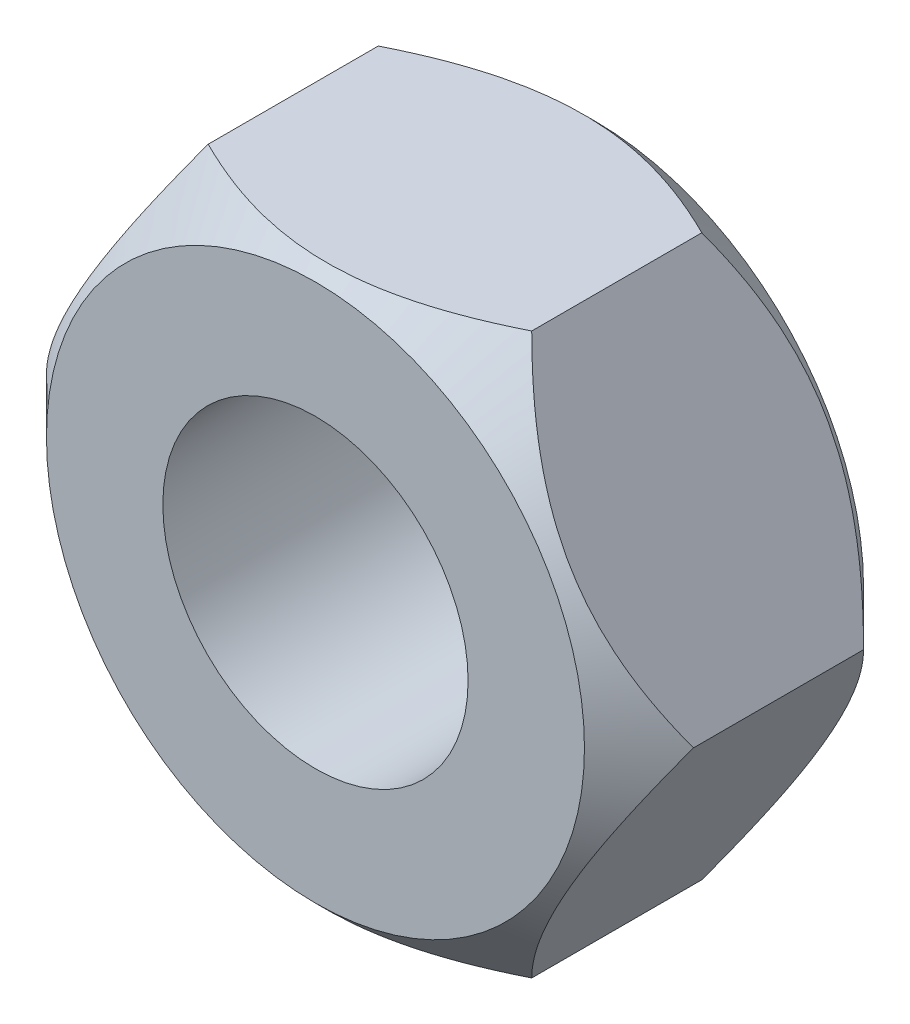
ISO-10303-21;
HEADER;
FILE_DESCRIPTION(('STEP AP214'),'2;1');
FILE_NAME('part.step','',(''),(''),'','','');
FILE_SCHEMA(('AUTOMOTIVE_DESIGN { 1 0 10303 214 1 1 1 1 }'));
ENDSEC;
DATA;
#1=APPLICATION_CONTEXT('core data for automotive mechanical design processes');
#2=APPLICATION_PROTOCOL_DEFINITION('international standard','automotive_design',2000,#1);
#3=PRODUCT_CONTEXT('',#1,'mechanical');
#4=PRODUCT('Part','Part','',(#3));
#5=PRODUCT_RELATED_PRODUCT_CATEGORY('part','',(#4));
#6=PRODUCT_DEFINITION_FORMATION('','',#4);
#7=PRODUCT_DEFINITION_CONTEXT('part definition',#1,'design');
#8=PRODUCT_DEFINITION('design','',#6,#7);
#9=PRODUCT_DEFINITION_SHAPE('','',#8);
#10=(LENGTH_UNIT() NAMED_UNIT(*) SI_UNIT(.MILLI.,.METRE.));
#11=(NAMED_UNIT(*) PLANE_ANGLE_UNIT() SI_UNIT($,.RADIAN.));
#12=(NAMED_UNIT(*) SI_UNIT($,.STERADIAN.) SOLID_ANGLE_UNIT());
#13=UNCERTAINTY_MEASURE_WITH_UNIT(LENGTH_MEASURE(1.E-05),#10,'distance_accuracy_value','');
#14=(GEOMETRIC_REPRESENTATION_CONTEXT(3) GLOBAL_UNCERTAINTY_ASSIGNED_CONTEXT((#13)) GLOBAL_UNIT_ASSIGNED_CONTEXT((#10,
#11,#12)) REPRESENTATION_CONTEXT('',''));
#15=CARTESIAN_POINT('',(0.,0.,0.));
#16=DIRECTION('',(0.,0.,1.));
#17=DIRECTION('',(1.,0.,0.));
#18=AXIS2_PLACEMENT_3D('',#15,#16,#17);
#19=CARTESIAN_POINT('',(3.70947547954334,-6.42500000000001,6.4));
#20=DIRECTION('',(-0.866025403784439,0.5,0.));
#21=DIRECTION('',(-0.5,-0.866025403784439,0.));
#22=AXIS2_PLACEMENT_3D('',#19,#20,#21);
#23=PLANE('',#22);
#24=CARTESIAN_POINT('',(3.7093600094895,-6.42520000000001,5.1498845272504));
#25=CARTESIAN_POINT('',(3.77314179247095,-6.31472671127881,5.21365971449062));
#26=CARTESIAN_POINT('',(3.83741383184615,-6.20340427357489,5.27547773177478));
#27=CARTESIAN_POINT('',(3.96703460328395,-5.97889451172836,5.39460406605384));
#28=CARTESIAN_POINT('',(4.032383900159,-5.86570620930186,5.45190992005934));
#29=CARTESIAN_POINT('',(4.23079904537341,-5.52204109679934,5.61665486894453));
#30=CARTESIAN_POINT('',(4.36554456763287,-5.28865500615355,5.71621855191125));
#31=CARTESIAN_POINT('',(4.6372696829266,-4.81801330077231,5.88671447143998));
#32=CARTESIAN_POINT('',(4.77417982638256,-4.58087797623504,5.95807624122495));
#33=CARTESIAN_POINT('',(4.98179587188563,-4.22127643695719,6.04062425710452));
#34=CARTESIAN_POINT('',(5.05130688494941,-4.10087983064513,6.06404678347401));
#35=CARTESIAN_POINT('',(5.19091746217391,-3.8590672176183,6.10219692979109));
#36=CARTESIAN_POINT('',(5.26101693678988,-3.73765136599955,6.11692584914305));
#37=CARTESIAN_POINT('',(5.43183995421817,-3.44177722071152,6.14162101994603));
#38=CARTESIAN_POINT('',(5.53274755215975,-3.26700013420697,6.14680250555282));
#39=CARTESIAN_POINT('',(5.73438087468879,-2.91776097508775,6.13810548352686));
#40=CARTESIAN_POINT('',(5.8351065231322,-2.74329903435845,6.1242202946606));
#41=CARTESIAN_POINT('',(6.03560819217453,-2.39601995657477,6.07820840287308));
#42=CARTESIAN_POINT('',(6.13538302372756,-2.22320487900829,6.04606130062709));
#43=CARTESIAN_POINT('',(6.33321780010524,-1.88054499481812,5.9652733002787));
#44=CARTESIAN_POINT('',(6.4312778758208,-1.71069996148472,5.91663366691598));
#45=CARTESIAN_POINT('',(6.60535154143774,-1.40919552837644,5.81656733231561));
#46=CARTESIAN_POINT('',(6.68175059387007,-1.27686848791352,5.76777241063987));
#47=CARTESIAN_POINT('',(6.83317725570953,-1.01458981598703,5.66231947321804));
#48=CARTESIAN_POINT('',(6.90820482345857,-0.884638256677372,5.60566121907526));
#49=CARTESIAN_POINT('',(7.05665220408022,-0.627519851190155,5.48575167457799));
#50=CARTESIAN_POINT('',(7.13007623886672,-0.50034569244322,5.42252111791879));
#51=CARTESIAN_POINT('',(7.27556470940478,-0.248352269555816,5.29029710289507));
#52=CARTESIAN_POINT('',(7.34762994617132,-0.123531618016685,5.22130717874164));
#53=CARTESIAN_POINT('',(7.41906642914053,0.000200000000003998,5.1498845272504));
#54=B_SPLINE_CURVE_WITH_KNOTS('',3,(#24,#25,#26,#27,#28,#29,#30,#31,#32,#33,#34,#35,#36,#37,#38,
#39,#40,#41,#42,#43,#44,#45,#46,#47,#48,#49,#50,#51,#52,#53),.UNSPECIFIED.,.F.,.F.,(4,2,2,2,2,2,
2,2,2,2,2,2,2,2,4),(0.,0.427827324092245,0.855886584057732,1.7166264971967,2.5636987639897,
2.98640416324017,3.40904636611792,4.01375044087843,4.61866646661638,5.22425954144019,
5.82980618649365,6.31078084523961,6.79177008912857,7.27128553213022,7.75050885555977),.UNSPECIFIED.);
#55=CARTESIAN_POINT('',(3.70947547954333,-6.42500000000001,5.15));
#56=VERTEX_POINT('',#55);
#57=CARTESIAN_POINT('',(7.41895095908669,0.,5.15));
#58=VERTEX_POINT('',#57);
#59=EDGE_CURVE('E85',#56,#58,#54,.T.);
#60=ORIENTED_EDGE('',*,*,#59,.F.);
#61=DIRECTION('',(0.,0.,-1.));
#62=VECTOR('',#61,1.);
#63=CARTESIAN_POINT('',(3.70947547954334,-6.42500000000001,6.4));
#64=LINE('',#63,#62);
#65=CARTESIAN_POINT('',(3.70947547954334,-6.42500000000001,1.25000000000001));
#66=VERTEX_POINT('',#65);
#67=EDGE_CURVE('E57',#56,#66,#64,.T.);
#68=ORIENTED_EDGE('',*,*,#67,.T.);
#69=CARTESIAN_POINT('',(7.41906642914053,0.00020000000000342,1.2501154727496));
#70=CARTESIAN_POINT('',(7.35528464615908,-0.110273288721193,1.18634028550938));
#71=CARTESIAN_POINT('',(7.29101260678388,-0.221595726425116,1.12452226822521));
#72=CARTESIAN_POINT('',(7.16139183534608,-0.446105488271647,1.00539593394616));
#73=CARTESIAN_POINT('',(7.09604253847103,-0.559293790698146,0.948090079940659));
#74=CARTESIAN_POINT('',(6.89762739325662,-0.902958903200661,0.783345131055463));
#75=CARTESIAN_POINT('',(6.76288187099716,-1.13634499384645,0.68378144808875));
#76=CARTESIAN_POINT('',(6.49115675570343,-1.60698669922769,0.513285528560022));
#77=CARTESIAN_POINT('',(6.35424661224747,-1.84412202376496,0.44192375877505));
#78=CARTESIAN_POINT('',(6.1466305667444,-2.20372356304281,0.359375742895485));
#79=CARTESIAN_POINT('',(6.07711955368062,-2.32412016935486,0.335953216525988));
#80=CARTESIAN_POINT('',(5.93750897645613,-2.5659327823817,0.29780307020891));
#81=CARTESIAN_POINT('',(5.86740950184015,-2.68734863400045,0.283074150856947));
#82=CARTESIAN_POINT('',(5.69658648441186,-2.98322277928847,0.258378980053977));
#83=CARTESIAN_POINT('',(5.59567888647028,-3.15799986579303,0.253197494447186));
#84=CARTESIAN_POINT('',(5.39404556394124,-3.50723902491225,0.261894516473142));
#85=CARTESIAN_POINT('',(5.29331991549783,-3.68170096564155,0.275779705339399));
#86=CARTESIAN_POINT('',(5.09281824645551,-4.02898004342522,0.321791597126917));
#87=CARTESIAN_POINT('',(4.99304341490247,-4.20179512099171,0.353938699372914));
#88=CARTESIAN_POINT('',(4.79520863852479,-4.54445500518188,0.434726699721304));
#89=CARTESIAN_POINT('',(4.69714856280923,-4.71430003851527,0.483366333084023));
#90=CARTESIAN_POINT('',(4.5230748971923,-5.01580447162356,0.583432667684396));
#91=CARTESIAN_POINT('',(4.44667584475996,-5.14813151208648,0.632227589360138));
#92=CARTESIAN_POINT('',(4.29524918292051,-5.41041018401297,0.737680526781962));
#93=CARTESIAN_POINT('',(4.22022161517146,-5.54036174332263,0.794338780924742));
#94=CARTESIAN_POINT('',(4.07177423454981,-5.79748014880985,0.914248325422014));
#95=CARTESIAN_POINT('',(3.99835019976331,-5.92465430755678,0.977478882081219));
#96=CARTESIAN_POINT('',(3.85286172922525,-6.17664773044419,1.10970289710494));
#97=CARTESIAN_POINT('',(3.7807964924587,-6.30146838198332,1.17869282125837));
#98=CARTESIAN_POINT('',(3.7093600094895,-6.42520000000001,1.2501154727496));
#99=B_SPLINE_CURVE_WITH_KNOTS('',3,(#69,#70,#71,#72,#73,#74,#75,#76,#77,#78,#79,#80,#81,#82,#83,
#84,#85,#86,#87,#88,#89,#90,#91,#92,#93,#94,#95,#96,#97,#98),.UNSPECIFIED.,.F.,.F.,(4,2,2,2,2,2,
2,2,2,2,2,2,2,2,4),(0.,0.427827324092244,0.85588658405773,1.71662649719669,2.56369876398969,
2.98640416324016,3.40904636611791,4.01375044087842,4.61866646661637,5.22425954144018,
5.82980618649364,6.3107808452396,6.79177008912857,7.27128553213022,7.75050885555976),.UNSPECIFIED.);
#100=CARTESIAN_POINT('',(7.41895095908669,0.,1.25));
#101=VERTEX_POINT('',#100);
#102=EDGE_CURVE('E101',#101,#66,#99,.T.);
#103=ORIENTED_EDGE('',*,*,#102,.F.);
#104=DIRECTION('',(0.,0.,-1.));
#105=VECTOR('',#104,1.);
#106=CARTESIAN_POINT('',(7.41895095908669,0.,6.4));
#107=LINE('',#106,#105);
#108=EDGE_CURVE('E11',#58,#101,#107,.T.);
#109=ORIENTED_EDGE('',*,*,#108,.F.);
#110=EDGE_LOOP('',(#60,#68,#103,#109));
#111=FACE_BOUND('',#110,.T.);
#112=ADVANCED_FACE('F33',(#111),#23,.F.);
#113=CARTESIAN_POINT('',(7.41895095908669,0.,6.4));
#114=DIRECTION('',(-0.866025403784438,-0.5,0.));
#115=DIRECTION('',(0.5,-0.866025403784438,0.));
#116=AXIS2_PLACEMENT_3D('',#113,#114,#115);
#117=PLANE('',#116);
#118=CARTESIAN_POINT('',(7.41906642914053,-0.000199999999996721,5.14988452725041));
#119=CARTESIAN_POINT('',(7.35528464615908,0.1102732887212,5.21365971449062));
#120=CARTESIAN_POINT('',(7.29101260678387,0.221595726425122,5.27547773177479));
#121=CARTESIAN_POINT('',(7.16139183534608,0.446105488271654,5.39460406605384));
#122=CARTESIAN_POINT('',(7.09604253847103,0.559293790698152,5.45190992005934));
#123=CARTESIAN_POINT('',(6.89762739325662,0.902958903200668,5.61665486894454));
#124=CARTESIAN_POINT('',(6.76288187099716,1.13634499384645,5.71621855191125));
#125=CARTESIAN_POINT('',(6.49115675570343,1.60698669922769,5.88671447143998));
#126=CARTESIAN_POINT('',(6.35424661224747,1.84412202376497,5.95807624122495));
#127=CARTESIAN_POINT('',(6.1466305667444,2.20372356304282,6.04062425710452));
#128=CARTESIAN_POINT('',(6.07711955368062,2.32412016935487,6.06404678347401));
#129=CARTESIAN_POINT('',(5.93750897645613,2.56593278238171,6.10219692979109));
#130=CARTESIAN_POINT('',(5.86740950184015,2.68734863400045,6.11692584914305));
#131=CARTESIAN_POINT('',(5.69658648441187,2.98322277928848,6.14162101994602));
#132=CARTESIAN_POINT('',(5.59567888647028,3.15799986579303,6.14680250555281));
#133=CARTESIAN_POINT('',(5.39404556394124,3.50723902491225,6.13810548352686));
#134=CARTESIAN_POINT('',(5.29331991549783,3.68170096564155,6.1242202946606));
#135=CARTESIAN_POINT('',(5.09281824645551,4.02898004342522,6.07820840287308));
#136=CARTESIAN_POINT('',(4.99304341490247,4.20179512099171,6.04606130062709));
#137=CARTESIAN_POINT('',(4.79520863852479,4.54445500518188,5.9652733002787));
#138=CARTESIAN_POINT('',(4.69714856280923,4.71430003851527,5.91663366691598));
#139=CARTESIAN_POINT('',(4.5230748971923,5.01580447162356,5.8165673323156));
#140=CARTESIAN_POINT('',(4.44667584475996,5.14813151208648,5.76777241063986));
#141=CARTESIAN_POINT('',(4.2952491829205,5.41041018401297,5.66231947321804));
#142=CARTESIAN_POINT('',(4.22022161517146,5.54036174332263,5.60566121907526));
#143=CARTESIAN_POINT('',(4.07177423454981,5.79748014880985,5.48575167457799));
#144=CARTESIAN_POINT('',(3.9983501997633,5.92465430755679,5.42252111791878));
#145=CARTESIAN_POINT('',(3.85286172922524,6.17664773044419,5.29029710289506));
#146=CARTESIAN_POINT('',(3.7807964924587,6.30146838198332,5.22130717874163));
#147=CARTESIAN_POINT('',(3.7093600094895,6.42520000000001,5.1498845272504));
#148=B_SPLINE_CURVE_WITH_KNOTS('',3,(#118,#119,#120,#121,#122,#123,#124,#125,#126,#127,#128,
#129,#130,#131,#132,#133,#134,#135,#136,#137,#138,#139,#140,#141,#142,#143,#144,#145,#146,#147),
.UNSPECIFIED.,.F.,.F.,(4,2,2,2,2,2,2,2,2,2,2,2,2,2,4),(0.,0.427827324092244,0.85588658405773,
1.71662649719669,2.56369876398969,2.98640416324016,3.40904636611791,4.01375044087841,
4.61866646661636,5.22425954144017,5.82980618649363,6.3107808452396,6.79177008912856,
7.27128553213022,7.75050885555976),.UNSPECIFIED.);
#149=CARTESIAN_POINT('',(3.70947547954332,6.42500000000001,5.15));
#150=VERTEX_POINT('',#149);
#151=EDGE_CURVE('E88',#58,#150,#148,.T.);
#152=ORIENTED_EDGE('',*,*,#151,.F.);
#153=ORIENTED_EDGE('',*,*,#108,.T.);
#154=CARTESIAN_POINT('',(3.7093600094895,6.42520000000001,1.2501154727496));
#155=CARTESIAN_POINT('',(3.77314179247094,6.31472671127881,1.18634028550938));
#156=CARTESIAN_POINT('',(3.83741383184615,6.20340427357489,1.12452226822522));
#157=CARTESIAN_POINT('',(3.96703460328394,5.97889451172836,1.00539593394616));
#158=CARTESIAN_POINT('',(4.032383900159,5.86570620930186,0.948090079940663));
#159=CARTESIAN_POINT('',(4.23079904537341,5.52204109679934,0.783345131055467));
#160=CARTESIAN_POINT('',(4.36554456763287,5.28865500615355,0.683781448088753));
#161=CARTESIAN_POINT('',(4.6372696829266,4.81801330077231,0.513285528560023));
#162=CARTESIAN_POINT('',(4.77417982638256,4.58087797623504,0.441923758775051));
#163=CARTESIAN_POINT('',(4.98179587188563,4.22127643695719,0.359375742895486));
#164=CARTESIAN_POINT('',(5.05130688494942,4.10087983064513,0.335953216525989));
#165=CARTESIAN_POINT('',(5.19091746217391,3.85906721761829,0.297803070208911));
#166=CARTESIAN_POINT('',(5.26101693678988,3.73765136599955,0.283074150856948));
#167=CARTESIAN_POINT('',(5.43183995421817,3.44177722071152,0.258378980053977));
#168=CARTESIAN_POINT('',(5.53274755215975,3.26700013420697,0.253197494447186));
#169=CARTESIAN_POINT('',(5.73438087468879,2.91776097508775,0.261894516473143));
#170=CARTESIAN_POINT('',(5.8351065231322,2.74329903435844,0.2757797053394));
#171=CARTESIAN_POINT('',(6.03560819217453,2.39601995657477,0.321791597126919));
#172=CARTESIAN_POINT('',(6.13538302372757,2.22320487900829,0.353938699372916));
#173=CARTESIAN_POINT('',(6.33321780010525,1.88054499481812,0.434726699721306));
#174=CARTESIAN_POINT('',(6.4312778758208,1.71069996148472,0.483366333084025));
#175=CARTESIAN_POINT('',(6.60535154143774,1.40919552837643,0.583432667684399));
#176=CARTESIAN_POINT('',(6.68175059387007,1.27686848791351,0.63222758936014));
#177=CARTESIAN_POINT('',(6.83317725570953,1.01458981598703,0.737680526781962));
#178=CARTESIAN_POINT('',(6.90820482345857,0.884638256677373,0.794338780924742));
#179=CARTESIAN_POINT('',(7.05665220408022,0.627519851190158,0.914248325422012));
#180=CARTESIAN_POINT('',(7.13007623886673,0.500345692443224,0.977478882081216));
#181=CARTESIAN_POINT('',(7.27556470940478,0.248352269555821,1.10970289710493));
#182=CARTESIAN_POINT('',(7.34762994617132,0.123531618016691,1.17869282125836));
#183=CARTESIAN_POINT('',(7.41906642914053,-0.000199999999996315,1.2501154727496));
#184=B_SPLINE_CURVE_WITH_KNOTS('',3,(#154,#155,#156,#157,#158,#159,#160,#161,#162,#163,#164,
#165,#166,#167,#168,#169,#170,#171,#172,#173,#174,#175,#176,#177,#178,#179,#180,#181,#182,#183),
.UNSPECIFIED.,.F.,.F.,(4,2,2,2,2,2,2,2,2,2,2,2,2,2,4),(0.,0.427827324092246,0.855886584057735,
1.7166264971967,2.5636987639897,2.98640416324018,3.40904636611793,4.01375044087843,
4.61866646661638,5.2242595414402,5.82980618649366,6.31078084523962,6.79177008912857,
7.27128553213022,7.75050885555976),.UNSPECIFIED.);
#185=CARTESIAN_POINT('',(3.70947547954332,6.42500000000001,1.25));
#186=VERTEX_POINT('',#185);
#187=EDGE_CURVE('E106',#186,#101,#184,.T.);
#188=ORIENTED_EDGE('',*,*,#187,.F.);
#189=DIRECTION('',(0.,0.,-1.));
#190=VECTOR('',#189,1.);
#191=CARTESIAN_POINT('',(3.70947547954334,6.42500000000001,6.4));
#192=LINE('',#191,#190);
#193=EDGE_CURVE('E42',#150,#186,#192,.T.);
#194=ORIENTED_EDGE('',*,*,#193,.F.);
#195=EDGE_LOOP('',(#152,#153,#188,#194));
#196=FACE_BOUND('',#195,.T.);
#197=ADVANCED_FACE('F96',(#196),#117,.F.);
#198=CARTESIAN_POINT('',(3.70947547954334,6.42500000000001,6.4));
#199=DIRECTION('',(0.,-1.,0.));
#200=DIRECTION('',(1.,0.,0.));
#201=AXIS2_PLACEMENT_3D('',#198,#199,#200);
#202=PLANE('',#201);
#203=CARTESIAN_POINT('',(-7.63839485887999,6.42500000000001,2.58768345339559));
#204=CARTESIAN_POINT('',(-7.45345101605897,6.42500000000001,2.72918407950395));
#205=CARTESIAN_POINT('',(-7.26749905003074,6.42500000000001,2.86938799391839));
#206=CARTESIAN_POINT('',(-6.89317104548009,6.42500000000001,3.14661345804127));
#207=CARTESIAN_POINT('',(-6.70479443404341,6.42500000000001,3.28363423333451));
#208=CARTESIAN_POINT('',(-6.32383175289455,6.42500000000001,3.55487972259566));
#209=CARTESIAN_POINT('',(-6.13122440338576,6.42500000000001,3.68907464799293));
#210=CARTESIAN_POINT('',(-5.74278445534404,6.42500000000001,3.95269665870895));
#211=CARTESIAN_POINT('',(-5.54695208184297,6.42500000000001,4.08212407466656));
#212=CARTESIAN_POINT('',(-5.13936452399145,6.42500000000001,4.34291533019862));
#213=CARTESIAN_POINT('',(-4.92737093821252,6.42500000000001,4.47390845142789));
#214=CARTESIAN_POINT('',(-4.49841277312683,6.42500000000001,4.72762315956));
#215=CARTESIAN_POINT('',(-4.28144737966754,6.42500000000001,4.85034337858515));
#216=CARTESIAN_POINT('',(-3.84250982333957,6.42500000000001,5.0848883679711));
#217=CARTESIAN_POINT('',(-3.62055489948986,6.42500000000001,5.19674514775338));
#218=CARTESIAN_POINT('',(-3.17043469315712,6.42500000000001,5.40705756805746));
#219=CARTESIAN_POINT('',(-2.94227236603915,6.42500000000001,5.50551945644243));
#220=CARTESIAN_POINT('',(-2.50091909151246,6.42500000000001,5.67708134156143));
#221=CARTESIAN_POINT('',(-2.28832121233228,6.42500000000001,5.7516914544856));
#222=CARTESIAN_POINT('',(-1.85779699675844,6.42500000000001,5.88388487985379));
#223=CARTESIAN_POINT('',(-1.63987031428453,6.42500000000001,5.94146708321973));
#224=CARTESIAN_POINT('',(-1.20373348896667,6.42500000000001,6.03556236028844));
#225=CARTESIAN_POINT('',(-0.985605867526378,6.42500000000001,6.07245155694779));
#226=CARTESIAN_POINT('',(-0.546752634776874,6.42500000000001,6.12440625520693));
#227=CARTESIAN_POINT('',(-0.326027542079054,6.42500000000001,6.13947604117027));
#228=CARTESIAN_POINT('',(0.106657810147887,6.42500000000001,6.14655671103339));
#229=CARTESIAN_POINT('',(0.31860310219223,6.42500000000001,6.13949529687863));
#230=CARTESIAN_POINT('',(0.740793122415162,6.42500000000001,6.10481052263441));
#231=CARTESIAN_POINT('',(0.951037690890796,6.42500000000001,6.07718525368444));
#232=CARTESIAN_POINT('',(1.37186459860112,6.42500000000001,6.00244878701603));
#233=CARTESIAN_POINT('',(1.58238549165574,6.42500000000001,5.95499731390354));
#234=CARTESIAN_POINT('',(1.99880713710022,6.42500000000001,5.84321043151732));
#235=CARTESIAN_POINT('',(2.20470818892544,6.42500000000001,5.77887611995752));
#236=CARTESIAN_POINT('',(2.62529119609302,6.42500000000001,5.63127202913907));
#237=CARTESIAN_POINT('',(2.83962266651233,6.42500000000001,5.54701451419835));
#238=CARTESIAN_POINT('',(3.26275874759823,6.42500000000001,5.36550308934582));
#239=CARTESIAN_POINT('',(3.47156079139891,6.42500000000001,5.26824326596832));
#240=CARTESIAN_POINT('',(3.88463319670047,6.42500000000001,5.06303548353579));
#241=CARTESIAN_POINT('',(4.08888698024998,6.42500000000001,4.95505442404246));
#242=CARTESIAN_POINT('',(4.49270897471665,6.42500000000001,4.73078325885728));
#243=CARTESIAN_POINT('',(4.69227790710955,6.42500000000001,4.61449444387699));
#244=CARTESIAN_POINT('',(5.07757412050162,6.42500000000001,4.38115090488334));
#245=CARTESIAN_POINT('',(5.26349774367343,6.42500000000001,4.26441866819872));
#246=CARTESIAN_POINT('',(5.63215122999809,6.42500000000001,4.02600075096803));
#247=CARTESIAN_POINT('',(5.81488085150213,6.42500000000001,3.90431469792944));
#248=CARTESIAN_POINT('',(6.17609157967517,6.42500000000001,3.65786762664784));
#249=CARTESIAN_POINT('',(6.35459505162082,6.42500000000001,3.53313927083453));
#250=CARTESIAN_POINT('',(6.70915550848882,6.42500000000001,3.28035055361421));
#251=CARTESIAN_POINT('',(6.88521315394651,6.42500000000001,3.15229111975261));
#252=CARTESIAN_POINT('',(7.06024527806808,6.42500000000001,3.02286860104665));
#253=B_SPLINE_CURVE_WITH_KNOTS('',3,(#203,#204,#205,#206,#207,#208,#209,#210,#211,#212,#213,
#214,#215,#216,#217,#218,#219,#220,#221,#222,#223,#224,#225,#226,#227,#228,#229,#230,#231,#232,
#233,#234,#235,#236,#237,#238,#239,#240,#241,#242,#243,#244,#245,#246,#247,#248,#249,#250,#251,
#252),.UNSPECIFIED.,.F.,.F.,(4,2,2,2,2,2,2,2,2,2,2,2,2,2,2,2,2,2,2,2,2,2,2,2,4),(0.,
0.69861161509681,1.39739144987408,2.10157109346033,2.80570180810076,3.5531507368689,
4.30072295050337,5.04602096912992,5.79097015300989,6.46631395068446,7.14170172581266,
7.80437880609352,8.46692574836179,9.10207689080351,9.73728699914187,10.3838786560876,
11.0304282823704,11.7207915338345,12.4114698383349,13.1043510643756,13.7971248759575,
14.4556268050386,15.1141783406708,15.7674254757314,16.4204926198895),.UNSPECIFIED.);
#254=CARTESIAN_POINT('',(-3.70947547954337,6.42499999999999,5.15));
#255=VERTEX_POINT('',#254);
#256=EDGE_CURVE('E99',#150,#255,#253,.F.);
#257=ORIENTED_EDGE('',*,*,#256,.F.);
#258=ORIENTED_EDGE('',*,*,#193,.T.);
#259=CARTESIAN_POINT('',(-7.63839485888,6.42500000000001,3.81231654660441));
#260=CARTESIAN_POINT('',(-7.45345101605897,6.42500000000001,3.67081592049605));
#261=CARTESIAN_POINT('',(-7.26749905003074,6.42500000000001,3.53061200608161));
#262=CARTESIAN_POINT('',(-6.89317104548009,6.42500000000001,3.25338654195873));
#263=CARTESIAN_POINT('',(-6.70479443404341,6.42500000000001,3.11636576666549));
#264=CARTESIAN_POINT('',(-6.32383175289455,6.42500000000001,2.84512027740435));
#265=CARTESIAN_POINT('',(-6.13122440338576,6.42500000000001,2.71092535200707));
#266=CARTESIAN_POINT('',(-5.74278445534404,6.42500000000001,2.44730334129106));
#267=CARTESIAN_POINT('',(-5.54695208184297,6.42500000000001,2.31787592533344));
#268=CARTESIAN_POINT('',(-5.13936452399145,6.42500000000001,2.05708466980138));
#269=CARTESIAN_POINT('',(-4.92737093821252,6.42500000000001,1.92609154857212));
#270=CARTESIAN_POINT('',(-4.49841277312684,6.42500000000001,1.67237684044001));
#271=CARTESIAN_POINT('',(-4.28144737966754,6.42500000000001,1.54965662141485));
#272=CARTESIAN_POINT('',(-3.84250982333957,6.42500000000001,1.3151116320289));
#273=CARTESIAN_POINT('',(-3.62055489948986,6.42500000000001,1.20325485224663));
#274=CARTESIAN_POINT('',(-3.17043469315713,6.42500000000001,0.992942431942542));
#275=CARTESIAN_POINT('',(-2.94227236603916,6.42500000000001,0.894480543557576));
#276=CARTESIAN_POINT('',(-2.50091909151247,6.42500000000001,0.722918658438571));
#277=CARTESIAN_POINT('',(-2.28832121233228,6.42500000000001,0.648308545514401));
#278=CARTESIAN_POINT('',(-1.85779699675844,6.42500000000001,0.516115120146216));
#279=CARTESIAN_POINT('',(-1.63987031428453,6.42500000000001,0.458532916780267));
#280=CARTESIAN_POINT('',(-1.20373348896667,6.42500000000001,0.364437639711558));
#281=CARTESIAN_POINT('',(-0.985605867526377,6.42500000000001,0.32754844305221));
#282=CARTESIAN_POINT('',(-0.546752634776872,6.42500000000001,0.275593744793075));
#283=CARTESIAN_POINT('',(-0.326027542079051,6.42500000000001,0.260523958829732));
#284=CARTESIAN_POINT('',(0.10665781014789,6.42500000000001,0.253443288966616));
#285=CARTESIAN_POINT('',(0.318603102192233,6.42500000000001,0.260504703121367));
#286=CARTESIAN_POINT('',(0.740793122415165,6.42500000000001,0.295189477365594));
#287=CARTESIAN_POINT('',(0.951037690890799,6.42500000000001,0.322814746315561));
#288=CARTESIAN_POINT('',(1.37186459860112,6.42500000000001,0.397551212983968));
#289=CARTESIAN_POINT('',(1.58238549165574,6.42500000000001,0.44500268609646));
#290=CARTESIAN_POINT('',(1.99880713710022,6.42500000000001,0.556789568482686));
#291=CARTESIAN_POINT('',(2.20470818892544,6.42500000000001,0.621123880042482));
#292=CARTESIAN_POINT('',(2.62529119609303,6.42500000000001,0.768727970860933));
#293=CARTESIAN_POINT('',(2.83962266651233,6.42500000000001,0.852985485801649));
#294=CARTESIAN_POINT('',(3.26275874759824,6.42500000000001,1.03449691065419));
#295=CARTESIAN_POINT('',(3.47156079139891,6.42500000000001,1.13175673403169));
#296=CARTESIAN_POINT('',(3.88463319670047,6.42500000000001,1.33696451646422));
#297=CARTESIAN_POINT('',(4.08888698024999,6.42500000000001,1.44494557595755));
#298=CARTESIAN_POINT('',(4.49270897471666,6.42500000000001,1.66921674114272));
#299=CARTESIAN_POINT('',(4.69227790710956,6.42500000000001,1.78550555612301));
#300=CARTESIAN_POINT('',(5.07757412050163,6.42500000000001,2.01884909511667));
#301=CARTESIAN_POINT('',(5.26349774367344,6.42500000000001,2.13558133180129));
#302=CARTESIAN_POINT('',(5.6321512299981,6.42500000000001,2.37399924903198));
#303=CARTESIAN_POINT('',(5.81488085150214,6.42500000000001,2.49568530207057));
#304=CARTESIAN_POINT('',(6.17609157967519,6.42500000000001,2.74213237335217));
#305=CARTESIAN_POINT('',(6.35459505162083,6.42500000000001,2.86686072916547));
#306=CARTESIAN_POINT('',(6.70915550848883,6.42500000000001,3.1196494463858));
#307=CARTESIAN_POINT('',(6.88521315394652,6.42500000000001,3.2477088802474));
#308=CARTESIAN_POINT('',(7.06024527806809,6.42500000000001,3.37713139895336));
#309=B_SPLINE_CURVE_WITH_KNOTS('',3,(#259,#260,#261,#262,#263,#264,#265,#266,#267,#268,#269,
#270,#271,#272,#273,#274,#275,#276,#277,#278,#279,#280,#281,#282,#283,#284,#285,#286,#287,#288,
#289,#290,#291,#292,#293,#294,#295,#296,#297,#298,#299,#300,#301,#302,#303,#304,#305,#306,#307,
#308),.UNSPECIFIED.,.F.,.F.,(4,2,2,2,2,2,2,2,2,2,2,2,2,2,2,2,2,2,2,2,2,2,2,2,4),(0.,
0.698611615096811,1.39739144987408,2.10157109346033,2.80570180810076,3.55315073686891,
4.30072295050337,5.04602096912992,5.79097015300989,6.46631395068446,7.14170172581266,
7.80437880609352,8.4669257483618,9.10207689080352,9.73728699914187,10.3838786560876,
11.0304282823704,11.7207915338345,12.4114698383349,13.1043510643756,13.7971248759575,
14.4556268050386,15.1141783406708,15.7674254757314,16.4204926198895),.UNSPECIFIED.);
#310=CARTESIAN_POINT('',(-3.70947547954337,6.42499999999999,1.25));
#311=VERTEX_POINT('',#310);
#312=EDGE_CURVE('E110',#311,#186,#309,.T.);
#313=ORIENTED_EDGE('',*,*,#312,.F.);
#314=DIRECTION('',(0.,0.,-1.));
#315=VECTOR('',#314,1.);
#316=CARTESIAN_POINT('',(-3.70947547954335,6.42500000000001,6.4));
#317=LINE('',#316,#315);
#318=EDGE_CURVE('E193',#255,#311,#317,.T.);
#319=ORIENTED_EDGE('',*,*,#318,.F.);
#320=EDGE_LOOP('',(#257,#258,#313,#319));
#321=FACE_BOUND('',#320,.T.);
#322=ADVANCED_FACE('F159',(#321),#202,.F.);
#323=CARTESIAN_POINT('',(-3.70947547954335,6.42500000000001,6.4));
#324=DIRECTION('',(0.866025403784439,-0.5,0.));
#325=DIRECTION('',(0.5,0.866025403784439,0.));
#326=AXIS2_PLACEMENT_3D('',#323,#324,#325);
#327=PLANE('',#326);
#328=CARTESIAN_POINT('',(-3.70936000948951,6.42520000000001,5.14988452725039));
#329=CARTESIAN_POINT('',(-3.77314179247096,6.31472671127881,5.21365971449061));
#330=CARTESIAN_POINT('',(-3.83741383184617,6.20340427357489,5.27547773177477));
#331=CARTESIAN_POINT('',(-3.96703460328396,5.97889451172836,5.39460406605383));
#332=CARTESIAN_POINT('',(-4.03238390015901,5.86570620930186,5.45190992005933));
#333=CARTESIAN_POINT('',(-4.23079904537343,5.52204109679934,5.61665486894453));
#334=CARTESIAN_POINT('',(-4.36554456763288,5.28865500615356,5.71621855191124));
#335=CARTESIAN_POINT('',(-4.63726968292661,4.81801330077232,5.88671447143997));
#336=CARTESIAN_POINT('',(-4.77417982638257,4.58087797623504,5.95807624122494));
#337=CARTESIAN_POINT('',(-4.98179587188564,4.22127643695719,6.0406242571045));
#338=CARTESIAN_POINT('',(-5.05130688494942,4.10087983064514,6.064046783474));
#339=CARTESIAN_POINT('',(-5.19091746217392,3.8590672176183,6.10219692979108));
#340=CARTESIAN_POINT('',(-5.26101693678989,3.73765136599955,6.11692584914304));
#341=CARTESIAN_POINT('',(-5.43183995421818,3.44177722071153,6.14162101994601));
#342=CARTESIAN_POINT('',(-5.53274755215976,3.26700013420698,6.1468025055528));
#343=CARTESIAN_POINT('',(-5.7343808746888,2.91776097508775,6.13810548352685));
#344=CARTESIAN_POINT('',(-5.83510652313221,2.74329903435845,6.12422029466059));
#345=CARTESIAN_POINT('',(-6.03560819217454,2.39601995657478,6.07820840287307));
#346=CARTESIAN_POINT('',(-6.13538302372757,2.22320487900829,6.04606130062708));
#347=CARTESIAN_POINT('',(-6.33321780010526,1.88054499481812,5.96527330027869));
#348=CARTESIAN_POINT('',(-6.43127787582081,1.71069996148473,5.91663366691597));
#349=CARTESIAN_POINT('',(-6.60535154143775,1.40919552837644,5.81656733231559));
#350=CARTESIAN_POINT('',(-6.68175059387008,1.27686848791352,5.76777241063985));
#351=CARTESIAN_POINT('',(-6.83317725570954,1.01458981598703,5.66231947321803));
#352=CARTESIAN_POINT('',(-6.90820482345858,0.884638256677375,5.60566121907525));
#353=CARTESIAN_POINT('',(-7.05665220408023,0.627519851190159,5.48575167457798));
#354=CARTESIAN_POINT('',(-7.13007623886674,0.500345692443224,5.42252111791877));
#355=CARTESIAN_POINT('',(-7.27556470940479,0.24835226955582,5.29029710289505));
#356=CARTESIAN_POINT('',(-7.34762994617134,0.123531618016689,5.22130717874163));
#357=CARTESIAN_POINT('',(-7.41906642914054,-0.000200000000000288,5.14988452725039));
#358=B_SPLINE_CURVE_WITH_KNOTS('',3,(#328,#329,#330,#331,#332,#333,#334,#335,#336,#337,#338,
#339,#340,#341,#342,#343,#344,#345,#346,#347,#348,#349,#350,#351,#352,#353,#354,#355,#356,#357),
.UNSPECIFIED.,.F.,.F.,(4,2,2,2,2,2,2,2,2,2,2,2,2,2,4),(0.,0.427827324092245,0.855886584057731,
1.7166264971967,2.56369876398969,2.98640416324017,3.40904636611791,4.01375044087842,
4.61866646661637,5.22425954144019,5.82980618649365,6.31078084523961,6.79177008912857,
7.27128553213022,7.75050885555976),.UNSPECIFIED.);
#359=CARTESIAN_POINT('',(-7.41895095908669,0.,5.15));
#360=VERTEX_POINT('',#359);
#361=EDGE_CURVE('E172',#255,#360,#358,.T.);
#362=ORIENTED_EDGE('',*,*,#361,.F.);
#363=ORIENTED_EDGE('',*,*,#318,.T.);
#364=CARTESIAN_POINT('',(-7.41906642914054,-0.000199999999999583,1.25011547274961));
#365=CARTESIAN_POINT('',(-7.35528464615909,0.110273288721197,1.18634028550939));
#366=CARTESIAN_POINT('',(-7.29101260678389,0.22159572642512,1.12452226822522));
#367=CARTESIAN_POINT('',(-7.16139183534609,0.446105488271652,1.00539593394617));
#368=CARTESIAN_POINT('',(-7.09604253847104,0.55929379069815,0.948090079940671));
#369=CARTESIAN_POINT('',(-6.89762739325663,0.902958903200667,0.783345131055475));
#370=CARTESIAN_POINT('',(-6.76288187099717,1.13634499384645,0.683781448088762));
#371=CARTESIAN_POINT('',(-6.49115675570344,1.60698669922769,0.513285528560034));
#372=CARTESIAN_POINT('',(-6.35424661224748,1.84412202376497,0.441923758775062));
#373=CARTESIAN_POINT('',(-6.14663056674441,2.20372356304282,0.359375742895497));
#374=CARTESIAN_POINT('',(-6.07711955368063,2.32412016935487,0.335953216526));
#375=CARTESIAN_POINT('',(-5.93750897645614,2.56593278238171,0.297803070208921));
#376=CARTESIAN_POINT('',(-5.86740950184016,2.68734863400046,0.283074150856958));
#377=CARTESIAN_POINT('',(-5.69658648441187,2.98322277928848,0.258378980053988));
#378=CARTESIAN_POINT('',(-5.59567888647029,3.15799986579304,0.253197494447198));
#379=CARTESIAN_POINT('',(-5.39404556394125,3.50723902491226,0.261894516473155));
#380=CARTESIAN_POINT('',(-5.29331991549784,3.68170096564156,0.275779705339411));
#381=CARTESIAN_POINT('',(-5.09281824645551,4.02898004342524,0.321791597126929));
#382=CARTESIAN_POINT('',(-4.99304341490248,4.20179512099172,0.353938699372927));
#383=CARTESIAN_POINT('',(-4.7952086385248,4.54445500518189,0.434726699721317));
#384=CARTESIAN_POINT('',(-4.69714856280924,4.71430003851529,0.483366333084037));
#385=CARTESIAN_POINT('',(-4.5230748971923,5.01580447162358,0.583432667684411));
#386=CARTESIAN_POINT('',(-4.44667584475997,5.14813151208649,0.632227589360151));
#387=CARTESIAN_POINT('',(-4.29524918292051,5.41041018401298,0.737680526781974));
#388=CARTESIAN_POINT('',(-4.22022161517147,5.54036174332264,0.794338780924754));
#389=CARTESIAN_POINT('',(-4.07177423454982,5.79748014880985,0.914248325422025));
#390=CARTESIAN_POINT('',(-3.99835019976332,5.92465430755679,0.97747888208123));
#391=CARTESIAN_POINT('',(-3.85286172922526,6.17664773044419,1.10970289710495));
#392=CARTESIAN_POINT('',(-3.78079649245872,6.30146838198332,1.17869282125837));
#393=CARTESIAN_POINT('',(-3.70936000948951,6.42520000000001,1.25011547274961));
#394=B_SPLINE_CURVE_WITH_KNOTS('',3,(#364,#365,#366,#367,#368,#369,#370,#371,#372,#373,#374,
#375,#376,#377,#378,#379,#380,#381,#382,#383,#384,#385,#386,#387,#388,#389,#390,#391,#392,#393),
.UNSPECIFIED.,.F.,.F.,(4,2,2,2,2,2,2,2,2,2,2,2,2,2,4),(0.,0.427827324092245,0.855886584057731,
1.7166264971967,2.56369876398969,2.98640416324017,3.40904636611792,4.01375044087843,
4.61866646661638,5.22425954144019,5.82980618649365,6.31078084523961,6.79177008912857,
7.27128553213022,7.75050885555976),.UNSPECIFIED.);
#395=CARTESIAN_POINT('',(-7.41895095908669,0.,1.25));
#396=VERTEX_POINT('',#395);
#397=EDGE_CURVE('E149',#396,#311,#394,.T.);
#398=ORIENTED_EDGE('',*,*,#397,.F.);
#399=DIRECTION('',(0.,0.,-1.));
#400=VECTOR('',#399,1.);
#401=CARTESIAN_POINT('',(-7.4189509590867,0.,6.4));
#402=LINE('',#401,#400);
#403=EDGE_CURVE('E195',#360,#396,#402,.T.);
#404=ORIENTED_EDGE('',*,*,#403,.F.);
#405=EDGE_LOOP('',(#362,#363,#398,#404));
#406=FACE_BOUND('',#405,.T.);
#407=ADVANCED_FACE('F162',(#406),#327,.F.);
#408=CARTESIAN_POINT('',(-7.4189509590867,0.,6.4));
#409=DIRECTION('',(0.866025403784439,0.5,0.));
#410=DIRECTION('',(-0.5,0.866025403784439,0.));
#411=AXIS2_PLACEMENT_3D('',#408,#409,#410);
#412=PLANE('',#411);
#413=CARTESIAN_POINT('',(-7.41906642914054,0.000200000000000558,5.14988452725039));
#414=CARTESIAN_POINT('',(-7.35528464615909,-0.110273288721195,5.21365971449061));
#415=CARTESIAN_POINT('',(-7.29101260678389,-0.221595726425118,5.27547773177478));
#416=CARTESIAN_POINT('',(-7.16139183534609,-0.446105488271649,5.39460406605383));
#417=CARTESIAN_POINT('',(-7.09604253847104,-0.559293790698148,5.45190992005933));
#418=CARTESIAN_POINT('',(-6.89762739325663,-0.902958903200665,5.61665486894452));
#419=CARTESIAN_POINT('',(-6.76288187099717,-1.13634499384645,5.71621855191124));
#420=CARTESIAN_POINT('',(-6.49115675570344,-1.60698669922769,5.88671447143997));
#421=CARTESIAN_POINT('',(-6.35424661224748,-1.84412202376496,5.95807624122494));
#422=CARTESIAN_POINT('',(-6.14663056674441,-2.20372356304281,6.0406242571045));
#423=CARTESIAN_POINT('',(-6.07711955368063,-2.32412016935487,6.064046783474));
#424=CARTESIAN_POINT('',(-5.93750897645614,-2.56593278238171,6.10219692979108));
#425=CARTESIAN_POINT('',(-5.86740950184017,-2.68734863400045,6.11692584914304));
#426=CARTESIAN_POINT('',(-5.69658648441187,-2.98322277928848,6.14162101994601));
#427=CARTESIAN_POINT('',(-5.59567888647029,-3.15799986579303,6.1468025055528));
#428=CARTESIAN_POINT('',(-5.39404556394125,-3.50723902491225,6.13810548352685));
#429=CARTESIAN_POINT('',(-5.29331991549784,-3.68170096564155,6.12422029466059));
#430=CARTESIAN_POINT('',(-5.09281824645551,-4.02898004342523,6.07820840287308));
#431=CARTESIAN_POINT('',(-4.99304341490248,-4.20179512099171,6.04606130062708));
#432=CARTESIAN_POINT('',(-4.7952086385248,-4.54445500518188,5.96527330027869));
#433=CARTESIAN_POINT('',(-4.69714856280924,-4.71430003851528,5.91663366691597));
#434=CARTESIAN_POINT('',(-4.5230748971923,-5.01580447162357,5.8165673323156));
#435=CARTESIAN_POINT('',(-4.44667584475997,-5.14813151208649,5.76777241063985));
#436=CARTESIAN_POINT('',(-4.29524918292052,-5.41041018401298,5.66231947321803));
#437=CARTESIAN_POINT('',(-4.22022161517148,-5.54036174332263,5.60566121907525));
#438=CARTESIAN_POINT('',(-4.07177423454982,-5.79748014880985,5.48575167457798));
#439=CARTESIAN_POINT('',(-3.99835019976331,-5.92465430755678,5.42252111791877));
#440=CARTESIAN_POINT('',(-3.85286172922526,-6.17664773044419,5.29029710289506));
#441=CARTESIAN_POINT('',(-3.78079649245871,-6.30146838198332,5.22130717874163));
#442=CARTESIAN_POINT('',(-3.70936000948951,-6.42520000000001,5.14988452725039));
#443=B_SPLINE_CURVE_WITH_KNOTS('',3,(#413,#414,#415,#416,#417,#418,#419,#420,#421,#422,#423,
#424,#425,#426,#427,#428,#429,#430,#431,#432,#433,#434,#435,#436,#437,#438,#439,#440,#441,#442),
.UNSPECIFIED.,.F.,.F.,(4,2,2,2,2,2,2,2,2,2,2,2,2,2,4),(0.,0.427827324092244,0.85588658405773,
1.71662649719669,2.56369876398969,2.98640416324016,3.40904636611791,4.01375044087842,
4.61866646661637,5.22425954144018,5.82980618649364,6.31078084523961,6.79177008912857,
7.27128553213022,7.75050885555976),.UNSPECIFIED.);
#444=CARTESIAN_POINT('',(-3.70947547954335,-6.42500000000001,5.14999999999999));
#445=VERTEX_POINT('',#444);
#446=EDGE_CURVE('E49',#360,#445,#443,.T.);
#447=ORIENTED_EDGE('',*,*,#446,.F.);
#448=ORIENTED_EDGE('',*,*,#403,.T.);
#449=CARTESIAN_POINT('',(-3.70936000948951,-6.42520000000001,1.25011547274961));
#450=CARTESIAN_POINT('',(-3.77314179247096,-6.31472671127881,1.18634028550939));
#451=CARTESIAN_POINT('',(-3.83741383184616,-6.20340427357489,1.12452226822522));
#452=CARTESIAN_POINT('',(-3.96703460328396,-5.97889451172836,1.00539593394617));
#453=CARTESIAN_POINT('',(-4.03238390015901,-5.86570620930186,0.948090079940669));
#454=CARTESIAN_POINT('',(-4.23079904537343,-5.52204109679934,0.783345131055474));
#455=CARTESIAN_POINT('',(-4.36554456763288,-5.28865500615355,0.683781448088761));
#456=CARTESIAN_POINT('',(-4.63726968292661,-4.81801330077231,0.513285528560033));
#457=CARTESIAN_POINT('',(-4.77417982638257,-4.58087797623504,0.44192375877506));
#458=CARTESIAN_POINT('',(-4.98179587188564,-4.22127643695719,0.359375742895495));
#459=CARTESIAN_POINT('',(-5.05130688494942,-4.10087983064513,0.335953216525998));
#460=CARTESIAN_POINT('',(-5.19091746217392,-3.8590672176183,0.29780307020892));
#461=CARTESIAN_POINT('',(-5.26101693678989,-3.73765136599955,0.283074150856957));
#462=CARTESIAN_POINT('',(-5.43183995421818,-3.44177722071153,0.258378980053987));
#463=CARTESIAN_POINT('',(-5.53274755215976,-3.26700013420697,0.253197494447197));
#464=CARTESIAN_POINT('',(-5.7343808746888,-2.91776097508775,0.261894516473153));
#465=CARTESIAN_POINT('',(-5.83510652313221,-2.74329903435845,0.27577970533941));
#466=CARTESIAN_POINT('',(-6.03560819217454,-2.39601995657477,0.321791597126928));
#467=CARTESIAN_POINT('',(-6.13538302372758,-2.22320487900829,0.353938699372926));
#468=CARTESIAN_POINT('',(-6.33321780010526,-1.88054499481812,0.434726699721316));
#469=CARTESIAN_POINT('',(-6.43127787582082,-1.71069996148472,0.483366333084035));
#470=CARTESIAN_POINT('',(-6.60535154143775,-1.40919552837643,0.583432667684409));
#471=CARTESIAN_POINT('',(-6.68175059387008,-1.27686848791351,0.63222758936015));
#472=CARTESIAN_POINT('',(-6.83317725570954,-1.01458981598703,0.737680526781973));
#473=CARTESIAN_POINT('',(-6.90820482345858,-0.884638256677371,0.794338780924753));
#474=CARTESIAN_POINT('',(-7.05665220408023,-0.627519851190155,0.914248325422024));
#475=CARTESIAN_POINT('',(-7.13007623886674,-0.500345692443221,0.977478882081228));
#476=CARTESIAN_POINT('',(-7.2755647094048,-0.248352269555818,1.10970289710495));
#477=CARTESIAN_POINT('',(-7.34762994617134,-0.123531618016688,1.17869282125837));
#478=CARTESIAN_POINT('',(-7.41906642914054,0.000200000000000119,1.25011547274961));
#479=B_SPLINE_CURVE_WITH_KNOTS('',3,(#449,#450,#451,#452,#453,#454,#455,#456,#457,#458,#459,
#460,#461,#462,#463,#464,#465,#466,#467,#468,#469,#470,#471,#472,#473,#474,#475,#476,#477,#478),
.UNSPECIFIED.,.F.,.F.,(4,2,2,2,2,2,2,2,2,2,2,2,2,2,4),(0.,0.427827324092246,0.855886584057733,
1.7166264971967,2.5636987639897,2.98640416324017,3.40904636611792,4.01375044087843,
4.61866646661637,5.22425954144019,5.82980618649365,6.31078084523961,6.79177008912857,
7.27128553213022,7.75050885555976),.UNSPECIFIED.);
#480=CARTESIAN_POINT('',(-3.70947547954333,-6.42500000000001,1.25));
#481=VERTEX_POINT('',#480);
#482=EDGE_CURVE('E142',#481,#396,#479,.T.);
#483=ORIENTED_EDGE('',*,*,#482,.F.);
#484=DIRECTION('',(0.,0.,-1.));
#485=VECTOR('',#484,1.);
#486=CARTESIAN_POINT('',(-3.70947547954335,-6.42500000000001,6.4));
#487=LINE('',#486,#485);
#488=EDGE_CURVE('E199',#445,#481,#487,.T.);
#489=ORIENTED_EDGE('',*,*,#488,.F.);
#490=EDGE_LOOP('',(#447,#448,#483,#489));
#491=FACE_BOUND('',#490,.T.);
#492=ADVANCED_FACE('F225',(#491),#412,.F.);
#493=CARTESIAN_POINT('',(-3.70947547954335,-6.42500000000001,6.4));
#494=DIRECTION('',(0.,1.,0.));
#495=DIRECTION('',(0.,0.,1.));
#496=AXIS2_PLACEMENT_3D('',#493,#494,#495);
#497=PLANE('',#496);
#498=CARTESIAN_POINT('',(-7.63839485887999,-6.42500000000001,2.58768345339559));
#499=CARTESIAN_POINT('',(-7.45345101605897,-6.42500000000001,2.72918407950395));
#500=CARTESIAN_POINT('',(-7.26749905003074,-6.42500000000001,2.86938799391839));
#501=CARTESIAN_POINT('',(-6.89317104548009,-6.42500000000001,3.14661345804127));
#502=CARTESIAN_POINT('',(-6.70479443404341,-6.42500000000001,3.28363423333451));
#503=CARTESIAN_POINT('',(-6.32383175289455,-6.42500000000001,3.55487972259566));
#504=CARTESIAN_POINT('',(-6.13122440338576,-6.42500000000001,3.68907464799293));
#505=CARTESIAN_POINT('',(-5.74278445534404,-6.42500000000001,3.95269665870895));
#506=CARTESIAN_POINT('',(-5.54695208184297,-6.42500000000001,4.08212407466656));
#507=CARTESIAN_POINT('',(-5.13936452399145,-6.42500000000001,4.34291533019862));
#508=CARTESIAN_POINT('',(-4.92737093821252,-6.42500000000001,4.47390845142789));
#509=CARTESIAN_POINT('',(-4.49841277312683,-6.42500000000001,4.72762315956));
#510=CARTESIAN_POINT('',(-4.28144737966754,-6.42500000000001,4.85034337858516));
#511=CARTESIAN_POINT('',(-3.84250982333956,-6.42500000000001,5.0848883679711));
#512=CARTESIAN_POINT('',(-3.62055489948986,-6.42500000000001,5.19674514775338));
#513=CARTESIAN_POINT('',(-3.17043469315712,-6.42500000000001,5.40705756805746));
#514=CARTESIAN_POINT('',(-2.94227236603915,-6.42500000000001,5.50551945644243));
#515=CARTESIAN_POINT('',(-2.50091909151246,-6.42500000000001,5.67708134156143));
#516=CARTESIAN_POINT('',(-2.28832121233228,-6.42500000000001,5.7516914544856));
#517=CARTESIAN_POINT('',(-1.85779699675844,-6.42500000000001,5.88388487985379));
#518=CARTESIAN_POINT('',(-1.63987031428453,-6.42500000000001,5.94146708321974));
#519=CARTESIAN_POINT('',(-1.20373348896668,-6.42500000000001,6.03556236028845));
#520=CARTESIAN_POINT('',(-0.98560586752638,-6.42500000000001,6.07245155694779));
#521=CARTESIAN_POINT('',(-0.546752634776875,-6.42500000000001,6.12440625520693));
#522=CARTESIAN_POINT('',(-0.326027542079055,-6.42500000000001,6.13947604117027));
#523=CARTESIAN_POINT('',(0.106657810147886,-6.42500000000001,6.14655671103339));
#524=CARTESIAN_POINT('',(0.318603102192229,-6.42500000000001,6.13949529687864));
#525=CARTESIAN_POINT('',(0.740793122415161,-6.42500000000001,6.10481052263441));
#526=CARTESIAN_POINT('',(0.951037690890794,-6.42500000000001,6.07718525368444));
#527=CARTESIAN_POINT('',(1.37186459860112,-6.42500000000001,6.00244878701604));
#528=CARTESIAN_POINT('',(1.58238549165574,-6.42500000000001,5.95499731390355));
#529=CARTESIAN_POINT('',(1.99880713710022,-6.42500000000001,5.84321043151732));
#530=CARTESIAN_POINT('',(2.20470818892543,-6.42500000000001,5.77887611995753));
#531=CARTESIAN_POINT('',(2.62529119609302,-6.42500000000001,5.63127202913908));
#532=CARTESIAN_POINT('',(2.83962266651232,-6.42500000000001,5.54701451419836));
#533=CARTESIAN_POINT('',(3.26275874759822,-6.42500000000001,5.36550308934582));
#534=CARTESIAN_POINT('',(3.4715607913989,-6.42500000000001,5.26824326596832));
#535=CARTESIAN_POINT('',(3.88463319670046,-6.42500000000001,5.06303548353579));
#536=CARTESIAN_POINT('',(4.08888698024998,-6.42500000000001,4.95505442404246));
#537=CARTESIAN_POINT('',(4.49270897471664,-6.42500000000001,4.73078325885729));
#538=CARTESIAN_POINT('',(4.69227790710955,-6.42500000000001,4.614494443877));
#539=CARTESIAN_POINT('',(5.07757412050161,-6.42500000000001,4.38115090488334));
#540=CARTESIAN_POINT('',(5.26349774367342,-6.42500000000001,4.26441866819873));
#541=CARTESIAN_POINT('',(5.63215122999808,-6.42500000000001,4.02600075096804));
#542=CARTESIAN_POINT('',(5.81488085150212,-6.42500000000001,3.90431469792945));
#543=CARTESIAN_POINT('',(6.17609157967516,-6.42500000000001,3.65786762664785));
#544=CARTESIAN_POINT('',(6.35459505162081,-6.42500000000001,3.53313927083454));
#545=CARTESIAN_POINT('',(6.70915550848881,-6.42500000000001,3.28035055361421));
#546=CARTESIAN_POINT('',(6.8852131539465,-6.42500000000001,3.15229111975262));
#547=CARTESIAN_POINT('',(7.06024527806807,-6.42500000000001,3.02286860104666));
#548=B_SPLINE_CURVE_WITH_KNOTS('',3,(#498,#499,#500,#501,#502,#503,#504,#505,#506,#507,#508,
#509,#510,#511,#512,#513,#514,#515,#516,#517,#518,#519,#520,#521,#522,#523,#524,#525,#526,#527,
#528,#529,#530,#531,#532,#533,#534,#535,#536,#537,#538,#539,#540,#541,#542,#543,#544,#545,#546,
#547),.UNSPECIFIED.,.F.,.F.,(4,2,2,2,2,2,2,2,2,2,2,2,2,2,2,2,2,2,2,2,2,2,2,2,4),(0.,
0.698611615096811,1.39739144987408,2.10157109346034,2.80570180810076,3.55315073686891,
4.30072295050338,5.04602096912992,5.79097015300989,6.46631395068446,7.14170172581266,
7.80437880609352,8.46692574836179,9.10207689080351,9.73728699914187,10.3838786560876,
11.0304282823704,11.7207915338345,12.4114698383349,13.1043510643756,13.7971248759575,
14.4556268050386,15.1141783406707,15.7674254757314,16.4204926198895),.UNSPECIFIED.);
#549=EDGE_CURVE('E90',#445,#56,#548,.T.);
#550=ORIENTED_EDGE('',*,*,#549,.F.);
#551=ORIENTED_EDGE('',*,*,#488,.T.);
#552=CARTESIAN_POINT('',(-7.63839485888,-6.42500000000001,3.81231654660441));
#553=CARTESIAN_POINT('',(-7.45345101605897,-6.42500000000001,3.67081592049605));
#554=CARTESIAN_POINT('',(-7.26749905003074,-6.42500000000001,3.53061200608161));
#555=CARTESIAN_POINT('',(-6.8931710454801,-6.42500000000001,3.25338654195873));
#556=CARTESIAN_POINT('',(-6.70479443404342,-6.42500000000001,3.11636576666549));
#557=CARTESIAN_POINT('',(-6.32383175289455,-6.42500000000001,2.84512027740434));
#558=CARTESIAN_POINT('',(-6.13122440338576,-6.42500000000001,2.71092535200707));
#559=CARTESIAN_POINT('',(-5.74278445534404,-6.42500000000001,2.44730334129105));
#560=CARTESIAN_POINT('',(-5.54695208184297,-6.42500000000001,2.31787592533344));
#561=CARTESIAN_POINT('',(-5.13936452399145,-6.42500000000001,2.05708466980138));
#562=CARTESIAN_POINT('',(-4.92737093821252,-6.42500000000001,1.92609154857211));
#563=CARTESIAN_POINT('',(-4.49841277312684,-6.42500000000001,1.67237684044));
#564=CARTESIAN_POINT('',(-4.28144737966754,-6.42500000000001,1.54965662141485));
#565=CARTESIAN_POINT('',(-3.84250982333957,-6.42500000000001,1.3151116320289));
#566=CARTESIAN_POINT('',(-3.62055489948986,-6.42500000000001,1.20325485224662));
#567=CARTESIAN_POINT('',(-3.17043469315713,-6.42500000000001,0.992942431942539));
#568=CARTESIAN_POINT('',(-2.94227236603915,-6.42500000000001,0.894480543557573));
#569=CARTESIAN_POINT('',(-2.50091909151246,-6.42500000000001,0.722918658438568));
#570=CARTESIAN_POINT('',(-2.28832121233228,-6.42500000000001,0.648308545514399));
#571=CARTESIAN_POINT('',(-1.85779699675844,-6.42500000000001,0.516115120146213));
#572=CARTESIAN_POINT('',(-1.63987031428453,-6.42500000000001,0.458532916780264));
#573=CARTESIAN_POINT('',(-1.20373348896667,-6.42500000000001,0.364437639711555));
#574=CARTESIAN_POINT('',(-0.985605867526377,-6.42500000000001,0.327548443052207));
#575=CARTESIAN_POINT('',(-0.546752634776872,-6.42500000000001,0.275593744793072));
#576=CARTESIAN_POINT('',(-0.326027542079052,-6.42500000000001,0.260523958829729));
#577=CARTESIAN_POINT('',(0.106657810147889,-6.42500000000001,0.253443288966613));
#578=CARTESIAN_POINT('',(0.318603102192232,-6.42500000000001,0.260504703121365));
#579=CARTESIAN_POINT('',(0.740793122415164,-6.42500000000001,0.295189477365591));
#580=CARTESIAN_POINT('',(0.951037690890798,-6.42500000000001,0.322814746315558));
#581=CARTESIAN_POINT('',(1.37186459860112,-6.42500000000001,0.397551212983964));
#582=CARTESIAN_POINT('',(1.58238549165574,-6.42500000000001,0.445002686096456));
#583=CARTESIAN_POINT('',(1.99880713710022,-6.42500000000001,0.556789568482682));
#584=CARTESIAN_POINT('',(2.20470818892544,-6.42500000000001,0.621123880042478));
#585=CARTESIAN_POINT('',(2.62529119609302,-6.42500000000001,0.768727970860929));
#586=CARTESIAN_POINT('',(2.83962266651233,-6.42500000000001,0.852985485801645));
#587=CARTESIAN_POINT('',(3.26275874759823,-6.42500000000001,1.03449691065418));
#588=CARTESIAN_POINT('',(3.47156079139891,-6.42500000000001,1.13175673403168));
#589=CARTESIAN_POINT('',(3.88463319670047,-6.42500000000001,1.33696451646421));
#590=CARTESIAN_POINT('',(4.08888698024999,-6.42500000000001,1.44494557595754));
#591=CARTESIAN_POINT('',(4.49270897471665,-6.42500000000001,1.66921674114272));
#592=CARTESIAN_POINT('',(4.69227790710956,-6.42500000000001,1.78550555612301));
#593=CARTESIAN_POINT('',(5.07757412050163,-6.42500000000001,2.01884909511667));
#594=CARTESIAN_POINT('',(5.26349774367344,-6.42500000000001,2.13558133180128));
#595=CARTESIAN_POINT('',(5.6321512299981,-6.42500000000001,2.37399924903198));
#596=CARTESIAN_POINT('',(5.81488085150214,-6.42500000000001,2.49568530207056));
#597=CARTESIAN_POINT('',(6.17609157967518,-6.42500000000001,2.74213237335216));
#598=CARTESIAN_POINT('',(6.35459505162083,-6.42500000000001,2.86686072916547));
#599=CARTESIAN_POINT('',(6.70915550848883,-6.42500000000001,3.1196494463858));
#600=CARTESIAN_POINT('',(6.88521315394652,-6.42500000000001,3.24770888024739));
#601=CARTESIAN_POINT('',(7.06024527806809,-6.42500000000001,3.37713139895335));
#602=B_SPLINE_CURVE_WITH_KNOTS('',3,(#552,#553,#554,#555,#556,#557,#558,#559,#560,#561,#562,
#563,#564,#565,#566,#567,#568,#569,#570,#571,#572,#573,#574,#575,#576,#577,#578,#579,#580,#581,
#582,#583,#584,#585,#586,#587,#588,#589,#590,#591,#592,#593,#594,#595,#596,#597,#598,#599,#600,
#601),.UNSPECIFIED.,.F.,.F.,(4,2,2,2,2,2,2,2,2,2,2,2,2,2,2,2,2,2,2,2,2,2,2,2,4),(0.,
0.69861161509681,1.39739144987408,2.10157109346034,2.80570180810076,3.55315073686891,
4.30072295050338,5.04602096912992,5.79097015300989,6.46631395068446,7.14170172581266,
7.80437880609352,8.4669257483618,9.10207689080352,9.73728699914187,10.3838786560876,
11.0304282823704,11.7207915338345,12.4114698383349,13.1043510643756,13.7971248759575,
14.4556268050386,15.1141783406708,15.7674254757314,16.4204926198895),.UNSPECIFIED.);
#603=EDGE_CURVE('E133',#66,#481,#602,.F.);
#604=ORIENTED_EDGE('',*,*,#603,.F.);
#605=ORIENTED_EDGE('',*,*,#67,.F.);
#606=EDGE_LOOP('',(#550,#551,#604,#605));
#607=FACE_BOUND('',#606,.T.);
#608=ADVANCED_FACE('F209',(#607),#497,.F.);
#609=CARTESIAN_POINT('',(0.,0.,6.4));
#610=DIRECTION('',(0.,0.,1.));
#611=DIRECTION('',(1.,0.,0.));
#612=AXIS2_PLACEMENT_3D('',#609,#610,#611);
#613=PLANE('',#612);
#614=CARTESIAN_POINT('',(0.,0.,6.4));
#615=DIRECTION('',(0.,0.,1.));
#616=DIRECTION('',(1.,0.,0.));
#617=AXIS2_PLACEMENT_3D('',#614,#615,#616);
#618=CIRCLE('',#617,3.5);
#619=CARTESIAN_POINT('',(3.5,0.,6.4));
#620=VERTEX_POINT('',#619);
#621=EDGE_CURVE('E37',#620,#620,#618,.T.);
#622=ORIENTED_EDGE('',*,*,#621,.F.);
#623=EDGE_LOOP('',(#622));
#624=FACE_BOUND('',#623,.T.);
#625=CARTESIAN_POINT('',(0.,0.,6.4));
#626=DIRECTION('',(0.,0.,1.));
#627=DIRECTION('',(1.,0.,0.));
#628=AXIS2_PLACEMENT_3D('',#625,#626,#627);
#629=CIRCLE('',#628,6.1689509590867);
#630=CARTESIAN_POINT('',(6.1689509590867,0.,6.4));
#631=VERTEX_POINT('',#630);
#632=EDGE_CURVE('E212',#631,#631,#629,.T.);
#633=ORIENTED_EDGE('',*,*,#632,.T.);
#634=EDGE_LOOP('',(#633));
#635=FACE_BOUND('',#634,.T.);
#636=ADVANCED_FACE('F205',(#624,#635),#613,.T.);
#637=CARTESIAN_POINT('',(0.,0.,0.));
#638=DIRECTION('',(0.,0.,1.));
#639=DIRECTION('',(1.,0.,0.));
#640=AXIS2_PLACEMENT_3D('',#637,#638,#639);
#641=PLANE('',#640);
#642=CARTESIAN_POINT('',(0.,0.,0.));
#643=DIRECTION('',(0.,0.,-1.));
#644=DIRECTION('',(-1.,0.,0.));
#645=AXIS2_PLACEMENT_3D('',#642,#643,#644);
#646=CIRCLE('',#645,3.5);
#647=CARTESIAN_POINT('',(-3.5,0.,0.));
#648=VERTEX_POINT('',#647);
#649=EDGE_CURVE('E105',#648,#648,#646,.T.);
#650=ORIENTED_EDGE('',*,*,#649,.F.);
#651=EDGE_LOOP('',(#650));
#652=FACE_BOUND('',#651,.T.);
#653=CARTESIAN_POINT('',(0.,0.,0.));
#654=DIRECTION('',(0.,0.,1.));
#655=DIRECTION('',(1.,0.,0.));
#656=AXIS2_PLACEMENT_3D('',#653,#654,#655);
#657=CIRCLE('',#656,6.1689509590867);
#658=CARTESIAN_POINT('',(6.1689509590867,0.,0.));
#659=VERTEX_POINT('',#658);
#660=EDGE_CURVE('E92',#659,#659,#657,.T.);
#661=ORIENTED_EDGE('',*,*,#660,.F.);
#662=EDGE_LOOP('',(#661));
#663=FACE_BOUND('',#662,.T.);
#664=ADVANCED_FACE('F208',(#652,#663),#641,.F.);
#665=CARTESIAN_POINT('',(0.,0.,0.));
#666=DIRECTION('',(0.,0.,-1.));
#667=DIRECTION('',(-1.,0.,0.));
#668=AXIS2_PLACEMENT_3D('',#665,#666,#667);
#669=CYLINDRICAL_SURFACE('',#668,3.5);
#670=ORIENTED_EDGE('',*,*,#621,.T.);
#671=EDGE_LOOP('',(#670));
#672=FACE_BOUND('',#671,.T.);
#673=ORIENTED_EDGE('',*,*,#649,.T.);
#674=EDGE_LOOP('',(#673));
#675=FACE_BOUND('',#674,.T.);
#676=ADVANCED_FACE('F126',(#672,#675),#669,.F.);
#677=CARTESIAN_POINT('',(0.,0.,1.25));
#678=DIRECTION('',(0.,0.,1.));
#679=DIRECTION('',(1.,0.,0.));
#680=AXIS2_PLACEMENT_3D('',#677,#678,#679);
#681=CONICAL_SURFACE('',#680,7.41895095908669,0.785398163397443);
#682=ORIENTED_EDGE('',*,*,#660,.T.);
#683=EDGE_LOOP('',(#682));
#684=FACE_BOUND('',#683,.T.);
#685=ORIENTED_EDGE('',*,*,#102,.T.);
#686=ORIENTED_EDGE('',*,*,#603,.T.);
#687=ORIENTED_EDGE('',*,*,#482,.T.);
#688=ORIENTED_EDGE('',*,*,#397,.T.);
#689=ORIENTED_EDGE('',*,*,#312,.T.);
#690=ORIENTED_EDGE('',*,*,#187,.T.);
#691=EDGE_LOOP('',(#685,#686,#687,#688,#689,#690));
#692=FACE_BOUND('',#691,.T.);
#693=ADVANCED_FACE('F121',(#684,#692),#681,.T.);
#694=CARTESIAN_POINT('',(0.,0.,6.4));
#695=DIRECTION('',(0.,0.,-1.));
#696=DIRECTION('',(-1.,0.,0.));
#697=AXIS2_PLACEMENT_3D('',#694,#695,#696);
#698=CONICAL_SURFACE('',#697,6.1689509590867,0.785398163397442);
#699=ORIENTED_EDGE('',*,*,#632,.F.);
#700=EDGE_LOOP('',(#699));
#701=FACE_BOUND('',#700,.T.);
#702=ORIENTED_EDGE('',*,*,#59,.T.);
#703=ORIENTED_EDGE('',*,*,#151,.T.);
#704=ORIENTED_EDGE('',*,*,#256,.T.);
#705=ORIENTED_EDGE('',*,*,#361,.T.);
#706=ORIENTED_EDGE('',*,*,#446,.T.);
#707=ORIENTED_EDGE('',*,*,#549,.T.);
#708=EDGE_LOOP('',(#702,#703,#704,#705,#706,#707));
#709=FACE_BOUND('',#708,.T.);
#710=ADVANCED_FACE('F87',(#701,#709),#698,.T.);
#711=CLOSED_SHELL('',(#112,#197,#322,#407,#492,#608,#636,#664,#676,#693,#710));
#712=MANIFOLD_SOLID_BREP('B2',#711);
#713=ADVANCED_BREP_SHAPE_REPRESENTATION('',(#18,#712),#14);
#714=SHAPE_DEFINITION_REPRESENTATION(#9,#713);
ENDSEC;
END-ISO-10303-21;
